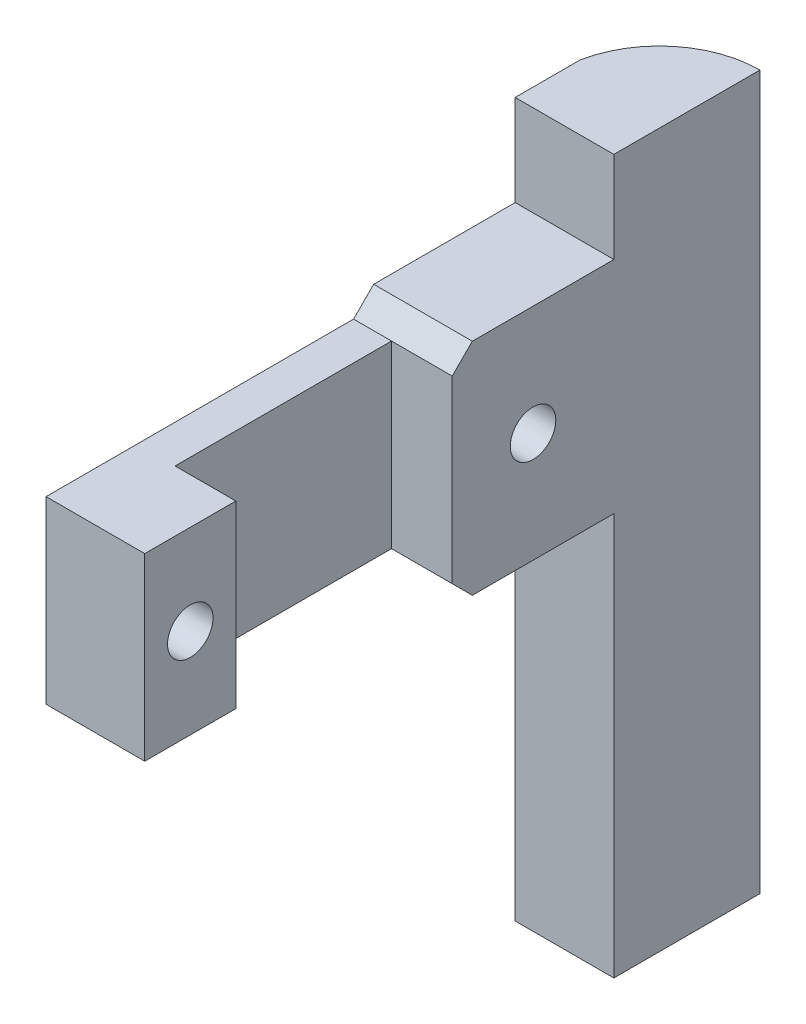
ISO-10303-21;
HEADER;
FILE_DESCRIPTION(('STEP AP214'),'2;1');
FILE_NAME('part.step','',(''),(''),'','','');
FILE_SCHEMA(('AUTOMOTIVE_DESIGN { 1 0 10303 214 1 1 1 1 }'));
ENDSEC;
DATA;
#1=APPLICATION_CONTEXT('core data for automotive mechanical design processes');
#2=APPLICATION_PROTOCOL_DEFINITION('international standard','automotive_design',2000,#1);
#3=PRODUCT_CONTEXT('',#1,'mechanical');
#4=PRODUCT('Part','Part','',(#3));
#5=PRODUCT_RELATED_PRODUCT_CATEGORY('part','',(#4));
#6=PRODUCT_DEFINITION_FORMATION('','',#4);
#7=PRODUCT_DEFINITION_CONTEXT('part definition',#1,'design');
#8=PRODUCT_DEFINITION('design','',#6,#7);
#9=PRODUCT_DEFINITION_SHAPE('','',#8);
#10=(LENGTH_UNIT() NAMED_UNIT(*) SI_UNIT(.MILLI.,.METRE.));
#11=(NAMED_UNIT(*) PLANE_ANGLE_UNIT() SI_UNIT($,.RADIAN.));
#12=(NAMED_UNIT(*) SI_UNIT($,.STERADIAN.) SOLID_ANGLE_UNIT());
#13=UNCERTAINTY_MEASURE_WITH_UNIT(LENGTH_MEASURE(1.E-05),#10,'distance_accuracy_value','');
#14=(GEOMETRIC_REPRESENTATION_CONTEXT(3) GLOBAL_UNCERTAINTY_ASSIGNED_CONTEXT((#13)) GLOBAL_UNIT_ASSIGNED_CONTEXT((#10,
#11,#12)) REPRESENTATION_CONTEXT('',''));
#15=CARTESIAN_POINT('',(0.,0.,0.));
#16=DIRECTION('',(0.,0.,1.));
#17=DIRECTION('',(1.,0.,0.));
#18=AXIS2_PLACEMENT_3D('',#15,#16,#17);
#19=CARTESIAN_POINT('',(4.87,11.8483495705504,42.17));
#20=DIRECTION('',(1.,0.,0.));
#21=DIRECTION('',(0.,1.,0.));
#22=AXIS2_PLACEMENT_3D('',#19,#20,#21);
#23=PLANE('',#22);
#24=DIRECTION('',(0.,0.,-1.));
#25=VECTOR('',#24,1.);
#26=CARTESIAN_POINT('',(4.87,11.8483495705504,42.17));
#27=LINE('',#26,#25);
#28=CARTESIAN_POINT('',(4.87,11.8483495705504,39.17));
#29=VERTEX_POINT('',#28);
#30=CARTESIAN_POINT('',(4.87,11.8483495705504,10.65));
#31=VERTEX_POINT('',#30);
#32=EDGE_CURVE('E234',#29,#31,#27,.T.);
#33=ORIENTED_EDGE('',*,*,#32,.F.);
#34=DIRECTION('',(0.,1.,0.));
#35=VECTOR('',#34,1.);
#36=CARTESIAN_POINT('',(4.87,11.8483495705504,39.17));
#37=LINE('',#36,#35);
#38=CARTESIAN_POINT('',(4.87,-11.8516504294496,39.17));
#39=VERTEX_POINT('',#38);
#40=EDGE_CURVE('E174',#39,#29,#37,.T.);
#41=ORIENTED_EDGE('',*,*,#40,.F.);
#42=DIRECTION('',(0.,0.,-1.));
#43=VECTOR('',#42,1.);
#44=CARTESIAN_POINT('',(4.87000000000001,-11.8516504294496,42.17));
#45=LINE('',#44,#43);
#46=CARTESIAN_POINT('',(4.87000000000001,-11.8516504294496,10.65));
#47=VERTEX_POINT('',#46);
#48=EDGE_CURVE('E167',#39,#47,#45,.T.);
#49=ORIENTED_EDGE('',*,*,#48,.T.);
#50=DIRECTION('',(0.,-1.,0.));
#51=VECTOR('',#50,1.);
#52=CARTESIAN_POINT('',(4.87,11.8483495705504,10.65));
#53=LINE('',#52,#51);
#54=CARTESIAN_POINT('',(4.87,-11.8483495705504,10.65));
#55=VERTEX_POINT('',#54);
#56=EDGE_CURVE('E219',#55,#47,#53,.T.);
#57=ORIENTED_EDGE('',*,*,#56,.F.);
#58=EDGE_CURVE('E220',#31,#55,#53,.T.);
#59=ORIENTED_EDGE('',*,*,#58,.F.);
#60=EDGE_LOOP('',(#33,#41,#49,#57,#59));
#61=FACE_BOUND('',#60,.T.);
#62=ADVANCED_FACE('F35',(#61),#23,.T.);
#63=CARTESIAN_POINT('',(25.87,14.5,10.65));
#64=DIRECTION('',(0.,0.,-1.));
#65=DIRECTION('',(0.,1.,0.));
#66=AXIS2_PLACEMENT_3D('',#63,#64,#65);
#67=PLANE('',#66);
#68=DIRECTION('',(0.,-1.,0.));
#69=VECTOR('',#68,1.);
#70=CARTESIAN_POINT('',(12.87,14.5,10.65));
#71=LINE('',#70,#69);
#72=CARTESIAN_POINT('',(12.87,11.8483495705504,10.65));
#73=VERTEX_POINT('',#72);
#74=CARTESIAN_POINT('',(12.87,-11.8483495705504,10.65));
#75=VERTEX_POINT('',#74);
#76=EDGE_CURVE('E194',#73,#75,#71,.T.);
#77=ORIENTED_EDGE('',*,*,#76,.F.);
#78=DIRECTION('',(-1.,0.,0.));
#79=VECTOR('',#78,1.);
#80=CARTESIAN_POINT('',(25.87,11.8483495705504,10.65));
#81=LINE('',#80,#79);
#82=EDGE_CURVE('E241',#73,#31,#81,.T.);
#83=ORIENTED_EDGE('',*,*,#82,.T.);
#84=ORIENTED_EDGE('',*,*,#58,.T.);
#85=DIRECTION('',(-1.,0.,0.));
#86=VECTOR('',#85,1.);
#87=CARTESIAN_POINT('',(25.87,-11.8483495705504,10.65));
#88=LINE('',#87,#86);
#89=EDGE_CURVE('E242',#75,#55,#88,.T.);
#90=ORIENTED_EDGE('',*,*,#89,.F.);
#91=EDGE_LOOP('',(#77,#83,#84,#90));
#92=FACE_BOUND('',#91,.T.);
#93=ADVANCED_FACE('F37',(#92),#67,.F.);
#94=CARTESIAN_POINT('',(25.87,-14.5,-10.65));
#95=DIRECTION('',(0.,1.,0.));
#96=DIRECTION('',(0.,0.,1.));
#97=AXIS2_PLACEMENT_3D('',#94,#95,#96);
#98=PLANE('',#97);
#99=DIRECTION('',(0.,0.,-1.));
#100=VECTOR('',#99,1.);
#101=CARTESIAN_POINT('',(12.87,-14.5,-10.65));
#102=LINE('',#101,#100);
#103=CARTESIAN_POINT('',(12.87,-14.5,7.99834957055045));
#104=VERTEX_POINT('',#103);
#105=CARTESIAN_POINT('',(12.87,-14.5,-10.65));
#106=VERTEX_POINT('',#105);
#107=EDGE_CURVE('E50',#104,#106,#102,.T.);
#108=ORIENTED_EDGE('',*,*,#107,.F.);
#109=DIRECTION('',(1.,0.,0.));
#110=VECTOR('',#109,1.);
#111=CARTESIAN_POINT('',(0.,-14.5,7.99834957055044));
#112=LINE('',#111,#110);
#113=CARTESIAN_POINT('',(-0.129999999999988,-14.5,7.99834957055044));
#114=VERTEX_POINT('',#113);
#115=EDGE_CURVE('E270',#114,#104,#112,.T.);
#116=ORIENTED_EDGE('',*,*,#115,.F.);
#117=DIRECTION('',(0.,0.,-1.));
#118=VECTOR('',#117,1.);
#119=CARTESIAN_POINT('',(-0.129999999999988,-14.5,-10.65));
#120=LINE('',#119,#118);
#121=CARTESIAN_POINT('',(-0.129999999999988,-14.5,-10.65));
#122=VERTEX_POINT('',#121);
#123=EDGE_CURVE('E251',#114,#122,#120,.T.);
#124=ORIENTED_EDGE('',*,*,#123,.T.);
#125=DIRECTION('',(-1.,0.,0.));
#126=VECTOR('',#125,1.);
#127=CARTESIAN_POINT('',(25.87,-14.5,-10.65));
#128=LINE('',#127,#126);
#129=EDGE_CURVE('E11',#106,#122,#128,.T.);
#130=ORIENTED_EDGE('',*,*,#129,.F.);
#131=EDGE_LOOP('',(#108,#116,#124,#130));
#132=FACE_BOUND('',#131,.T.);
#133=ADVANCED_FACE('F305',(#132),#98,.F.);
#134=CARTESIAN_POINT('',(0.,-67.5,-30.65));
#135=DIRECTION('',(0.,1.,0.));
#136=DIRECTION('',(0.,0.,1.));
#137=AXIS2_PLACEMENT_3D('',#134,#135,#136);
#138=PLANE('',#137);
#139=DIRECTION('',(0.,0.,-1.));
#140=VECTOR('',#139,1.);
#141=CARTESIAN_POINT('',(12.87,-67.5,-30.65));
#142=LINE('',#141,#140);
#143=CARTESIAN_POINT('',(12.87,-67.5,-10.65));
#144=VERTEX_POINT('',#143);
#145=CARTESIAN_POINT('',(12.87,-67.5,-29.9));
#146=VERTEX_POINT('',#145);
#147=EDGE_CURVE('E189',#144,#146,#142,.T.);
#148=ORIENTED_EDGE('',*,*,#147,.F.);
#149=DIRECTION('',(-1.,0.,0.));
#150=VECTOR('',#149,1.);
#151=CARTESIAN_POINT('',(0.,-67.5,-10.65));
#152=LINE('',#151,#150);
#153=CARTESIAN_POINT('',(-0.12999999999995,-67.5,-10.65));
#154=VERTEX_POINT('',#153);
#155=EDGE_CURVE('E262',#144,#154,#152,.T.);
#156=ORIENTED_EDGE('',*,*,#155,.T.);
#157=DIRECTION('',(0.,0.,1.));
#158=VECTOR('',#157,1.);
#159=CARTESIAN_POINT('',(-0.12999999999995,-67.5,-30.65));
#160=LINE('',#159,#158);
#161=CARTESIAN_POINT('',(-0.12999999999995,-67.5,-19.2117376914899));
#162=VERTEX_POINT('',#161);
#163=EDGE_CURVE('E214',#162,#154,#160,.T.);
#164=ORIENTED_EDGE('',*,*,#163,.F.);
#165=CARTESIAN_POINT('',(12.87,-67.5,-16.65));
#166=DIRECTION('',(0.,-1.,0.));
#167=DIRECTION('',(0.,0.,-1.));
#168=AXIS2_PLACEMENT_3D('',#165,#166,#167);
#169=CIRCLE('',#168,13.25);
#170=EDGE_CURVE('E258',#162,#146,#169,.T.);
#171=ORIENTED_EDGE('',*,*,#170,.T.);
#172=EDGE_LOOP('',(#148,#156,#164,#171));
#173=FACE_BOUND('',#172,.T.);
#174=ADVANCED_FACE('F297',(#173),#138,.F.);
#175=CARTESIAN_POINT('',(0.,26.5,-30.65));
#176=DIRECTION('',(0.,-1.,0.));
#177=DIRECTION('',(1.,0.,0.));
#178=AXIS2_PLACEMENT_3D('',#175,#176,#177);
#179=PLANE('',#178);
#180=DIRECTION('',(0.,0.,1.));
#181=VECTOR('',#180,1.);
#182=CARTESIAN_POINT('',(12.87,26.5,-30.65));
#183=LINE('',#182,#181);
#184=CARTESIAN_POINT('',(12.87,26.5,-29.9));
#185=VERTEX_POINT('',#184);
#186=CARTESIAN_POINT('',(12.87,26.5,-10.65));
#187=VERTEX_POINT('',#186);
#188=EDGE_CURVE('E161',#185,#187,#183,.T.);
#189=ORIENTED_EDGE('',*,*,#188,.F.);
#190=CARTESIAN_POINT('',(12.87,26.5,-16.65));
#191=DIRECTION('',(0.,-1.,0.));
#192=DIRECTION('',(0.,0.,-1.));
#193=AXIS2_PLACEMENT_3D('',#190,#191,#192);
#194=CIRCLE('',#193,13.25);
#195=CARTESIAN_POINT('',(-0.129999999999996,26.5,-19.2117376914899));
#196=VERTEX_POINT('',#195);
#197=EDGE_CURVE('E259',#196,#185,#194,.T.);
#198=ORIENTED_EDGE('',*,*,#197,.F.);
#199=DIRECTION('',(0.,0.,1.));
#200=VECTOR('',#199,1.);
#201=CARTESIAN_POINT('',(-0.130000000000009,26.5,-30.65));
#202=LINE('',#201,#200);
#203=CARTESIAN_POINT('',(-0.130000000000009,26.5,-10.65));
#204=VERTEX_POINT('',#203);
#205=EDGE_CURVE('E217',#196,#204,#202,.T.);
#206=ORIENTED_EDGE('',*,*,#205,.T.);
#207=DIRECTION('',(1.,0.,0.));
#208=VECTOR('',#207,1.);
#209=CARTESIAN_POINT('',(0.,26.5,-10.65));
#210=LINE('',#209,#208);
#211=EDGE_CURVE('E266',#204,#187,#210,.T.);
#212=ORIENTED_EDGE('',*,*,#211,.T.);
#213=EDGE_LOOP('',(#189,#198,#206,#212));
#214=FACE_BOUND('',#213,.T.);
#215=ADVANCED_FACE('F289',(#214),#179,.F.);
#216=CARTESIAN_POINT('',(25.87,14.5,-10.65));
#217=DIRECTION('',(0.,-1.,0.));
#218=DIRECTION('',(0.,0.,-1.));
#219=AXIS2_PLACEMENT_3D('',#216,#217,#218);
#220=PLANE('',#219);
#221=DIRECTION('',(0.,0.,1.));
#222=VECTOR('',#221,1.);
#223=CARTESIAN_POINT('',(12.87,14.5,-10.65));
#224=LINE('',#223,#222);
#225=CARTESIAN_POINT('',(12.87,14.5,-10.65));
#226=VERTEX_POINT('',#225);
#227=CARTESIAN_POINT('',(12.87,14.5,7.99834957055046));
#228=VERTEX_POINT('',#227);
#229=EDGE_CURVE('E199',#226,#228,#224,.T.);
#230=ORIENTED_EDGE('',*,*,#229,.F.);
#231=DIRECTION('',(-1.,0.,0.));
#232=VECTOR('',#231,1.);
#233=CARTESIAN_POINT('',(25.87,14.5,-10.65));
#234=LINE('',#233,#232);
#235=CARTESIAN_POINT('',(-0.130000000000001,14.5,-10.65));
#236=VERTEX_POINT('',#235);
#237=EDGE_CURVE('E43',#226,#236,#234,.T.);
#238=ORIENTED_EDGE('',*,*,#237,.T.);
#239=DIRECTION('',(0.,0.,1.));
#240=VECTOR('',#239,1.);
#241=CARTESIAN_POINT('',(-0.130000000000002,14.5,-10.65));
#242=LINE('',#241,#240);
#243=CARTESIAN_POINT('',(-0.130000000000002,14.5,7.99834957055046));
#244=VERTEX_POINT('',#243);
#245=EDGE_CURVE('E244',#236,#244,#242,.T.);
#246=ORIENTED_EDGE('',*,*,#245,.T.);
#247=DIRECTION('',(1.,0.,0.));
#248=VECTOR('',#247,1.);
#249=CARTESIAN_POINT('',(0.,14.5,7.99834957055046));
#250=LINE('',#249,#248);
#251=EDGE_CURVE('E269',#244,#228,#250,.T.);
#252=ORIENTED_EDGE('',*,*,#251,.T.);
#253=EDGE_LOOP('',(#230,#238,#246,#252));
#254=FACE_BOUND('',#253,.T.);
#255=ADVANCED_FACE('F278',(#254),#220,.F.);
#256=CARTESIAN_POINT('',(0.,14.5,7.99834957055046));
#257=DIRECTION('',(0.,0.707106781186544,0.707106781186551));
#258=DIRECTION('',(0.,-0.707106781186551,0.707106781186544));
#259=AXIS2_PLACEMENT_3D('',#256,#257,#258);
#260=PLANE('',#259);
#261=ORIENTED_EDGE('',*,*,#82,.F.);
#262=DIRECTION('',(0.,0.707106781186551,-0.707106781186544));
#263=VECTOR('',#262,1.);
#264=CARTESIAN_POINT('',(12.87,14.5,7.99834957055046));
#265=LINE('',#264,#263);
#266=EDGE_CURVE('E196',#73,#228,#265,.T.);
#267=ORIENTED_EDGE('',*,*,#266,.T.);
#268=ORIENTED_EDGE('',*,*,#251,.F.);
#269=DIRECTION('',(0.,-0.707106781186551,0.707106781186544));
#270=VECTOR('',#269,1.);
#271=CARTESIAN_POINT('',(-0.130000000000002,14.5,7.99834957055046));
#272=LINE('',#271,#270);
#273=CARTESIAN_POINT('',(-0.130000000000002,11.8483495705504,10.65));
#274=VERTEX_POINT('',#273);
#275=EDGE_CURVE('E236',#244,#274,#272,.T.);
#276=ORIENTED_EDGE('',*,*,#275,.T.);
#277=DIRECTION('',(1.,0.,0.));
#278=VECTOR('',#277,1.);
#279=CARTESIAN_POINT('',(-0.130000000000002,11.8483495705504,10.65));
#280=LINE('',#279,#278);
#281=EDGE_CURVE('E223',#274,#31,#280,.T.);
#282=ORIENTED_EDGE('',*,*,#281,.T.);
#283=EDGE_LOOP('',(#261,#267,#268,#276,#282));
#284=FACE_BOUND('',#283,.T.);
#285=ADVANCED_FACE('F320',(#284),#260,.T.);
#286=CARTESIAN_POINT('',(0.,-11.2491747852751,11.2491747852753));
#287=DIRECTION('',(0.,0.707106781186544,-0.707106781186551));
#288=DIRECTION('',(0.,0.707106781186551,0.707106781186544));
#289=AXIS2_PLACEMENT_3D('',#286,#287,#288);
#290=PLANE('',#289);
#291=DIRECTION('',(0.,-0.707106781186551,-0.707106781186544));
#292=VECTOR('',#291,1.);
#293=CARTESIAN_POINT('',(12.87,-11.2491747852751,11.2491747852753));
#294=LINE('',#293,#292);
#295=EDGE_CURVE('E192',#75,#104,#294,.T.);
#296=ORIENTED_EDGE('',*,*,#295,.F.);
#297=ORIENTED_EDGE('',*,*,#89,.T.);
#298=CARTESIAN_POINT('',(-0.129999999999989,-11.8483495705504,10.65));
#299=VERTEX_POINT('',#298);
#300=EDGE_CURVE('E240',#55,#299,#88,.T.);
#301=ORIENTED_EDGE('',*,*,#300,.T.);
#302=DIRECTION('',(0.,0.707106781186551,0.707106781186544));
#303=VECTOR('',#302,1.);
#304=CARTESIAN_POINT('',(-0.129999999999988,-11.2491747852752,11.2491747852753));
#305=LINE('',#304,#303);
#306=EDGE_CURVE('E237',#114,#299,#305,.T.);
#307=ORIENTED_EDGE('',*,*,#306,.F.);
#308=ORIENTED_EDGE('',*,*,#115,.T.);
#309=EDGE_LOOP('',(#296,#297,#301,#307,#308));
#310=FACE_BOUND('',#309,.T.);
#311=ADVANCED_FACE('F308',(#310),#290,.F.);
#312=CARTESIAN_POINT('',(25.87,-11.8516504294496,42.17));
#313=DIRECTION('',(0.,1.,0.));
#314=DIRECTION('',(0.,0.,1.));
#315=AXIS2_PLACEMENT_3D('',#312,#313,#314);
#316=PLANE('',#315);
#317=DIRECTION('',(-1.,0.,0.));
#318=VECTOR('',#317,1.);
#319=CARTESIAN_POINT('',(12.87,-11.8516504294496,39.17));
#320=LINE('',#319,#318);
#321=CARTESIAN_POINT('',(12.87,-11.8516504294496,39.17));
#322=VERTEX_POINT('',#321);
#323=EDGE_CURVE('E164',#322,#39,#320,.T.);
#324=ORIENTED_EDGE('',*,*,#323,.F.);
#325=DIRECTION('',(0.,0.,-1.));
#326=VECTOR('',#325,1.);
#327=CARTESIAN_POINT('',(12.87,-11.8516504294496,42.17));
#328=LINE('',#327,#326);
#329=CARTESIAN_POINT('',(12.87,-11.8516504294496,51.17));
#330=VERTEX_POINT('',#329);
#331=EDGE_CURVE('E149',#330,#322,#328,.T.);
#332=ORIENTED_EDGE('',*,*,#331,.F.);
#333=DIRECTION('',(1.,0.,0.));
#334=VECTOR('',#333,1.);
#335=CARTESIAN_POINT('',(25.87,-11.8516504294496,51.17));
#336=LINE('',#335,#334);
#337=CARTESIAN_POINT('',(-0.129999999999988,-11.8516504294496,51.17));
#338=VERTEX_POINT('',#337);
#339=EDGE_CURVE('E256',#338,#330,#336,.T.);
#340=ORIENTED_EDGE('',*,*,#339,.F.);
#341=DIRECTION('',(0.,0.,-1.));
#342=VECTOR('',#341,1.);
#343=CARTESIAN_POINT('',(-0.129999999999991,-11.8516504294496,42.17));
#344=LINE('',#343,#342);
#345=CARTESIAN_POINT('',(-0.129999999999991,-11.8516504294496,10.65));
#346=VERTEX_POINT('',#345);
#347=EDGE_CURVE('E230',#338,#346,#344,.T.);
#348=ORIENTED_EDGE('',*,*,#347,.T.);
#349=DIRECTION('',(-1.,0.,0.));
#350=VECTOR('',#349,1.);
#351=CARTESIAN_POINT('',(-0.129999999999991,-11.8516504294496,10.65));
#352=LINE('',#351,#350);
#353=EDGE_CURVE('E227',#47,#346,#352,.T.);
#354=ORIENTED_EDGE('',*,*,#353,.F.);
#355=ORIENTED_EDGE('',*,*,#48,.F.);
#356=EDGE_LOOP('',(#324,#332,#340,#348,#354,#355));
#357=FACE_BOUND('',#356,.T.);
#358=ADVANCED_FACE('F165',(#357),#316,.F.);
#359=CARTESIAN_POINT('',(25.87,11.8483495705504,42.17));
#360=DIRECTION('',(0.,-1.,0.));
#361=DIRECTION('',(0.,0.,-1.));
#362=AXIS2_PLACEMENT_3D('',#359,#360,#361);
#363=PLANE('',#362);
#364=DIRECTION('',(-1.,0.,0.));
#365=VECTOR('',#364,1.);
#366=CARTESIAN_POINT('',(25.87,11.8483495705504,51.17));
#367=LINE('',#366,#365);
#368=CARTESIAN_POINT('',(12.87,11.8483495705504,51.17));
#369=VERTEX_POINT('',#368);
#370=CARTESIAN_POINT('',(-0.130000000000002,11.8483495705504,51.17));
#371=VERTEX_POINT('',#370);
#372=EDGE_CURVE('E254',#369,#371,#367,.T.);
#373=ORIENTED_EDGE('',*,*,#372,.F.);
#374=DIRECTION('',(0.,0.,1.));
#375=VECTOR('',#374,1.);
#376=CARTESIAN_POINT('',(12.87,11.8483495705504,42.17));
#377=LINE('',#376,#375);
#378=CARTESIAN_POINT('',(12.87,11.8483495705504,39.17));
#379=VERTEX_POINT('',#378);
#380=EDGE_CURVE('E184',#379,#369,#377,.T.);
#381=ORIENTED_EDGE('',*,*,#380,.F.);
#382=DIRECTION('',(-1.,0.,0.));
#383=VECTOR('',#382,1.);
#384=CARTESIAN_POINT('',(12.87,11.8483495705504,39.17));
#385=LINE('',#384,#383);
#386=EDGE_CURVE('E170',#379,#29,#385,.T.);
#387=ORIENTED_EDGE('',*,*,#386,.T.);
#388=ORIENTED_EDGE('',*,*,#32,.T.);
#389=ORIENTED_EDGE('',*,*,#281,.F.);
#390=DIRECTION('',(0.,0.,-1.));
#391=VECTOR('',#390,1.);
#392=CARTESIAN_POINT('',(-0.130000000000002,11.8483495705504,42.17));
#393=LINE('',#392,#391);
#394=EDGE_CURVE('E232',#371,#274,#393,.T.);
#395=ORIENTED_EDGE('',*,*,#394,.F.);
#396=EDGE_LOOP('',(#373,#381,#387,#388,#389,#395));
#397=FACE_BOUND('',#396,.T.);
#398=ADVANCED_FACE('F325',(#397),#363,.F.);
#399=CARTESIAN_POINT('',(0.,0.,-10.65));
#400=DIRECTION('',(0.,0.,1.));
#401=DIRECTION('',(0.,-1.,0.));
#402=AXIS2_PLACEMENT_3D('',#399,#400,#401);
#403=PLANE('',#402);
#404=ORIENTED_EDGE('',*,*,#237,.F.);
#405=DIRECTION('',(0.,1.,0.));
#406=VECTOR('',#405,1.);
#407=CARTESIAN_POINT('',(12.87,0.,-10.65));
#408=LINE('',#407,#406);
#409=EDGE_CURVE('E201',#226,#187,#408,.T.);
#410=ORIENTED_EDGE('',*,*,#409,.T.);
#411=ORIENTED_EDGE('',*,*,#211,.F.);
#412=DIRECTION('',(0.,-1.,0.));
#413=VECTOR('',#412,1.);
#414=CARTESIAN_POINT('',(-0.130000000000009,26.5,-10.65));
#415=LINE('',#414,#413);
#416=EDGE_CURVE('E211',#204,#236,#415,.T.);
#417=ORIENTED_EDGE('',*,*,#416,.T.);
#418=EDGE_LOOP('',(#404,#410,#411,#417));
#419=FACE_BOUND('',#418,.T.);
#420=ADVANCED_FACE('F286',(#419),#403,.T.);
#421=ORIENTED_EDGE('',*,*,#155,.F.);
#422=DIRECTION('',(0.,1.,0.));
#423=VECTOR('',#422,1.);
#424=CARTESIAN_POINT('',(12.87,0.,-10.65));
#425=LINE('',#424,#423);
#426=EDGE_CURVE('E186',#144,#106,#425,.T.);
#427=ORIENTED_EDGE('',*,*,#426,.T.);
#428=ORIENTED_EDGE('',*,*,#129,.T.);
#429=EDGE_CURVE('E210',#122,#154,#415,.T.);
#430=ORIENTED_EDGE('',*,*,#429,.T.);
#431=EDGE_LOOP('',(#421,#427,#428,#430));
#432=FACE_BOUND('',#431,.T.);
#433=ADVANCED_FACE('F300',(#432),#403,.T.);
#434=CARTESIAN_POINT('',(0.,0.,51.17));
#435=DIRECTION('',(0.,0.,-1.));
#436=DIRECTION('',(-1.,0.,0.));
#437=AXIS2_PLACEMENT_3D('',#434,#435,#436);
#438=PLANE('',#437);
#439=DIRECTION('',(0.,1.,0.));
#440=VECTOR('',#439,1.);
#441=CARTESIAN_POINT('',(12.87,69.9983495705505,51.17));
#442=LINE('',#441,#440);
#443=EDGE_CURVE('E156',#330,#369,#442,.T.);
#444=ORIENTED_EDGE('',*,*,#443,.T.);
#445=ORIENTED_EDGE('',*,*,#372,.T.);
#446=DIRECTION('',(0.,1.,0.));
#447=VECTOR('',#446,1.);
#448=CARTESIAN_POINT('',(-0.130000000000002,11.8483495705504,51.17));
#449=LINE('',#448,#447);
#450=EDGE_CURVE('E160',#338,#371,#449,.T.);
#451=ORIENTED_EDGE('',*,*,#450,.F.);
#452=ORIENTED_EDGE('',*,*,#339,.T.);
#453=EDGE_LOOP('',(#444,#445,#451,#452));
#454=FACE_BOUND('',#453,.T.);
#455=ADVANCED_FACE('F327',(#454),#438,.F.);
#456=CARTESIAN_POINT('',(-0.129999999999995,0.,0.));
#457=DIRECTION('',(1.,0.,0.));
#458=DIRECTION('',(0.,0.,1.));
#459=AXIS2_PLACEMENT_3D('',#456,#457,#458);
#460=PLANE('',#459);
#461=CARTESIAN_POINT('',(-0.130000000000026,0.,45.17));
#462=DIRECTION('',(1.,0.,0.));
#463=DIRECTION('',(0.,0.,-1.));
#464=AXIS2_PLACEMENT_3D('',#461,#462,#463);
#465=CIRCLE('',#464,3.);
#466=CARTESIAN_POINT('',(-0.130000000000026,0.,42.17));
#467=VERTEX_POINT('',#466);
#468=EDGE_CURVE('E366',#467,#467,#465,.T.);
#469=ORIENTED_EDGE('',*,*,#468,.T.);
#470=EDGE_LOOP('',(#469));
#471=FACE_BOUND('',#470,.T.);
#472=CARTESIAN_POINT('',(-0.130000000000026,0.,0.));
#473=DIRECTION('',(1.,0.,0.));
#474=DIRECTION('',(0.,0.,-1.));
#475=AXIS2_PLACEMENT_3D('',#472,#473,#474);
#476=CIRCLE('',#475,3.);
#477=CARTESIAN_POINT('',(-0.130000000000026,0.,-3.));
#478=VERTEX_POINT('',#477);
#479=EDGE_CURVE('E177',#478,#478,#476,.T.);
#480=ORIENTED_EDGE('',*,*,#479,.T.);
#481=EDGE_LOOP('',(#480));
#482=FACE_BOUND('',#481,.T.);
#483=ORIENTED_EDGE('',*,*,#205,.F.);
#484=DIRECTION('',(0.,-1.,0.));
#485=VECTOR('',#484,1.);
#486=CARTESIAN_POINT('',(-0.129999999999996,26.5,-19.2117376914899));
#487=LINE('',#486,#485);
#488=EDGE_CURVE('E207',#196,#162,#487,.T.);
#489=ORIENTED_EDGE('',*,*,#488,.T.);
#490=ORIENTED_EDGE('',*,*,#163,.T.);
#491=ORIENTED_EDGE('',*,*,#429,.F.);
#492=ORIENTED_EDGE('',*,*,#123,.F.);
#493=ORIENTED_EDGE('',*,*,#306,.T.);
#494=DIRECTION('',(0.,1.,0.));
#495=VECTOR('',#494,1.);
#496=CARTESIAN_POINT('',(-0.130000000000002,11.8483495705504,10.65));
#497=LINE('',#496,#495);
#498=EDGE_CURVE('E58',#346,#299,#497,.T.);
#499=ORIENTED_EDGE('',*,*,#498,.F.);
#500=ORIENTED_EDGE('',*,*,#347,.F.);
#501=ORIENTED_EDGE('',*,*,#450,.T.);
#502=ORIENTED_EDGE('',*,*,#394,.T.);
#503=ORIENTED_EDGE('',*,*,#275,.F.);
#504=ORIENTED_EDGE('',*,*,#245,.F.);
#505=ORIENTED_EDGE('',*,*,#416,.F.);
#506=EDGE_LOOP('',(#483,#489,#490,#491,#492,#493,#499,#500,#501,#502,#503,#504,#505));
#507=FACE_BOUND('',#506,.T.);
#508=ADVANCED_FACE('F284',(#471,#482,#507),#460,.F.);
#509=CARTESIAN_POINT('',(12.87,26.5,-16.65));
#510=DIRECTION('',(0.,-1.,0.));
#511=DIRECTION('',(0.,0.,-1.));
#512=AXIS2_PLACEMENT_3D('',#509,#510,#511);
#513=CYLINDRICAL_SURFACE('',#512,13.25);
#514=DIRECTION('',(0.,1.,0.));
#515=VECTOR('',#514,1.);
#516=CARTESIAN_POINT('',(12.87,69.9983495705505,-29.9));
#517=LINE('',#516,#515);
#518=EDGE_CURVE('E182',#146,#185,#517,.T.);
#519=ORIENTED_EDGE('',*,*,#518,.F.);
#520=ORIENTED_EDGE('',*,*,#170,.F.);
#521=ORIENTED_EDGE('',*,*,#488,.F.);
#522=ORIENTED_EDGE('',*,*,#197,.T.);
#523=EDGE_LOOP('',(#519,#520,#521,#522));
#524=FACE_BOUND('',#523,.T.);
#525=ADVANCED_FACE('F335',(#524),#513,.T.);
#526=CARTESIAN_POINT('',(25.74,0.,10.65));
#527=DIRECTION('',(0.,0.,-1.));
#528=DIRECTION('',(1.,0.,0.));
#529=AXIS2_PLACEMENT_3D('',#526,#527,#528);
#530=PLANE('',#529);
#531=ORIENTED_EDGE('',*,*,#300,.F.);
#532=ORIENTED_EDGE('',*,*,#56,.T.);
#533=ORIENTED_EDGE('',*,*,#353,.T.);
#534=ORIENTED_EDGE('',*,*,#498,.T.);
#535=EDGE_LOOP('',(#531,#532,#533,#534));
#536=FACE_BOUND('',#535,.T.);
#537=ADVANCED_FACE('F312',(#536),#530,.T.);
#538=CARTESIAN_POINT('',(12.87,69.9983495705505,-29.9));
#539=DIRECTION('',(1.,0.,0.));
#540=DIRECTION('',(0.,1.,0.));
#541=AXIS2_PLACEMENT_3D('',#538,#539,#540);
#542=PLANE('',#541);
#543=CARTESIAN_POINT('',(12.87,0.,45.17));
#544=DIRECTION('',(1.,0.,0.));
#545=DIRECTION('',(0.,0.,-1.));
#546=AXIS2_PLACEMENT_3D('',#543,#544,#545);
#547=CIRCLE('',#546,3.);
#548=CARTESIAN_POINT('',(12.87,0.,42.17));
#549=VERTEX_POINT('',#548);
#550=EDGE_CURVE('E369',#549,#549,#547,.T.);
#551=ORIENTED_EDGE('',*,*,#550,.F.);
#552=EDGE_LOOP('',(#551));
#553=FACE_BOUND('',#552,.T.);
#554=ORIENTED_EDGE('',*,*,#380,.T.);
#555=ORIENTED_EDGE('',*,*,#443,.F.);
#556=ORIENTED_EDGE('',*,*,#331,.T.);
#557=DIRECTION('',(0.,1.,0.));
#558=VECTOR('',#557,1.);
#559=CARTESIAN_POINT('',(12.87,11.8483495705504,39.17));
#560=LINE('',#559,#558);
#561=EDGE_CURVE('E153',#322,#379,#560,.T.);
#562=ORIENTED_EDGE('',*,*,#561,.T.);
#563=EDGE_LOOP('',(#554,#555,#556,#562));
#564=FACE_BOUND('',#563,.T.);
#565=ADVANCED_FACE('F151',(#553,#564),#542,.T.);
#566=CARTESIAN_POINT('',(12.87,0.,0.));
#567=DIRECTION('',(1.,0.,0.));
#568=DIRECTION('',(0.,0.,-1.));
#569=AXIS2_PLACEMENT_3D('',#566,#567,#568);
#570=CIRCLE('',#569,3.);
#571=CARTESIAN_POINT('',(12.87,0.,-3.));
#572=VERTEX_POINT('',#571);
#573=EDGE_CURVE('E371',#572,#572,#570,.T.);
#574=ORIENTED_EDGE('',*,*,#573,.F.);
#575=EDGE_LOOP('',(#574));
#576=FACE_BOUND('',#575,.T.);
#577=ORIENTED_EDGE('',*,*,#188,.T.);
#578=ORIENTED_EDGE('',*,*,#409,.F.);
#579=ORIENTED_EDGE('',*,*,#229,.T.);
#580=ORIENTED_EDGE('',*,*,#266,.F.);
#581=ORIENTED_EDGE('',*,*,#76,.T.);
#582=ORIENTED_EDGE('',*,*,#295,.T.);
#583=ORIENTED_EDGE('',*,*,#107,.T.);
#584=ORIENTED_EDGE('',*,*,#426,.F.);
#585=ORIENTED_EDGE('',*,*,#147,.T.);
#586=ORIENTED_EDGE('',*,*,#518,.T.);
#587=EDGE_LOOP('',(#577,#578,#579,#580,#581,#582,#583,#584,#585,#586));
#588=FACE_BOUND('',#587,.T.);
#589=ADVANCED_FACE('F350',(#576,#588),#542,.T.);
#590=CARTESIAN_POINT('',(12.87,11.8483495705504,39.17));
#591=DIRECTION('',(0.,0.,1.));
#592=DIRECTION('',(0.,-1.,0.));
#593=AXIS2_PLACEMENT_3D('',#590,#591,#592);
#594=PLANE('',#593);
#595=ORIENTED_EDGE('',*,*,#40,.T.);
#596=ORIENTED_EDGE('',*,*,#386,.F.);
#597=ORIENTED_EDGE('',*,*,#561,.F.);
#598=ORIENTED_EDGE('',*,*,#323,.T.);
#599=EDGE_LOOP('',(#595,#596,#597,#598));
#600=FACE_BOUND('',#599,.T.);
#601=ADVANCED_FACE('F172',(#600),#594,.F.);
#602=CARTESIAN_POINT('',(12.87,0.,0.));
#603=DIRECTION('',(1.,0.,0.));
#604=DIRECTION('',(0.,0.,-1.));
#605=AXIS2_PLACEMENT_3D('',#602,#603,#604);
#606=CYLINDRICAL_SURFACE('',#605,3.);
#607=ORIENTED_EDGE('',*,*,#479,.F.);
#608=EDGE_LOOP('',(#607));
#609=FACE_BOUND('',#608,.T.);
#610=ORIENTED_EDGE('',*,*,#573,.T.);
#611=EDGE_LOOP('',(#610));
#612=FACE_BOUND('',#611,.T.);
#613=ADVANCED_FACE('F354',(#609,#612),#606,.F.);
#614=CARTESIAN_POINT('',(12.87,0.,45.17));
#615=DIRECTION('',(1.,0.,0.));
#616=DIRECTION('',(0.,0.,-1.));
#617=AXIS2_PLACEMENT_3D('',#614,#615,#616);
#618=CYLINDRICAL_SURFACE('',#617,3.);
#619=ORIENTED_EDGE('',*,*,#468,.F.);
#620=EDGE_LOOP('',(#619));
#621=FACE_BOUND('',#620,.T.);
#622=ORIENTED_EDGE('',*,*,#550,.T.);
#623=EDGE_LOOP('',(#622));
#624=FACE_BOUND('',#623,.T.);
#625=ADVANCED_FACE('F357',(#621,#624),#618,.F.);
#626=CLOSED_SHELL('',(#62,#93,#133,#174,#215,#255,#285,#311,#358,#398,#420,#433,#455,#508,#525,
#537,#565,#589,#601,#613,#625));
#627=MANIFOLD_SOLID_BREP('B2',#626);
#628=ADVANCED_BREP_SHAPE_REPRESENTATION('',(#18,#627),#14);
#629=SHAPE_DEFINITION_REPRESENTATION(#9,#628);
ENDSEC;
END-ISO-10303-21;
